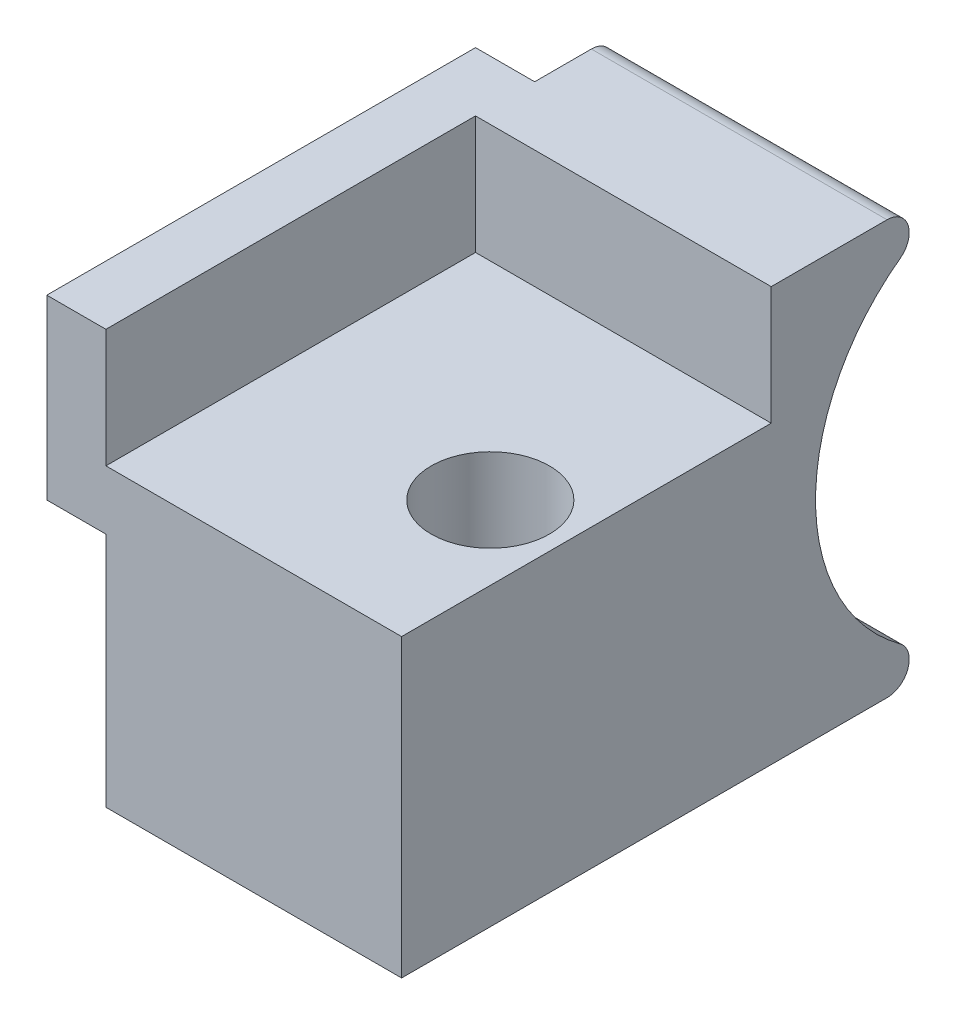
ISO-10303-21;
HEADER;
FILE_DESCRIPTION(('STEP AP214'),'2;1');
FILE_NAME('part.step','',(''),(''),'','','');
FILE_SCHEMA(('AUTOMOTIVE_DESIGN { 1 0 10303 214 1 1 1 1 }'));
ENDSEC;
DATA;
#1=APPLICATION_CONTEXT('core data for automotive mechanical design processes');
#2=APPLICATION_PROTOCOL_DEFINITION('international standard','automotive_design',2000,#1);
#3=PRODUCT_CONTEXT('',#1,'mechanical');
#4=PRODUCT('Part','Part','',(#3));
#5=PRODUCT_RELATED_PRODUCT_CATEGORY('part','',(#4));
#6=PRODUCT_DEFINITION_FORMATION('','',#4);
#7=PRODUCT_DEFINITION_CONTEXT('part definition',#1,'design');
#8=PRODUCT_DEFINITION('design','',#6,#7);
#9=PRODUCT_DEFINITION_SHAPE('','',#8);
#10=(LENGTH_UNIT() NAMED_UNIT(*) SI_UNIT(.MILLI.,.METRE.));
#11=(NAMED_UNIT(*) PLANE_ANGLE_UNIT() SI_UNIT($,.RADIAN.));
#12=(NAMED_UNIT(*) SI_UNIT($,.STERADIAN.) SOLID_ANGLE_UNIT());
#13=UNCERTAINTY_MEASURE_WITH_UNIT(LENGTH_MEASURE(1.E-05),#10,'distance_accuracy_value','');
#14=(GEOMETRIC_REPRESENTATION_CONTEXT(3) GLOBAL_UNCERTAINTY_ASSIGNED_CONTEXT((#13)) GLOBAL_UNIT_ASSIGNED_CONTEXT((#10,
#11,#12)) REPRESENTATION_CONTEXT('',''));
#15=CARTESIAN_POINT('',(0.,0.,0.));
#16=DIRECTION('',(0.,0.,1.));
#17=DIRECTION('',(1.,0.,0.));
#18=AXIS2_PLACEMENT_3D('',#15,#16,#17);
#19=CARTESIAN_POINT('',(0.5,-1.4,0.916515138991168));
#20=DIRECTION('',(-1.,0.,0.));
#21=DIRECTION('',(0.,0.,1.));
#22=AXIS2_PLACEMENT_3D('',#19,#20,#21);
#23=PLANE('',#22);
#24=CARTESIAN_POINT('',(0.5,1.25,0.916515138991168));
#25=DIRECTION('',(1.,0.,0.));
#26=DIRECTION('',(0.,0.,-1.));
#27=AXIS2_PLACEMENT_3D('',#24,#25,#26);
#28=CIRCLE('',#27,0.15);
#29=CARTESIAN_POINT('',(0.5,1.12903225806452,0.82782012554041));
#30=VERTEX_POINT('',#29);
#31=CARTESIAN_POINT('',(0.5,1.4,0.916515138991168));
#32=VERTEX_POINT('',#31);
#33=EDGE_CURVE('E49',#30,#32,#28,.T.);
#34=ORIENTED_EDGE('',*,*,#33,.T.);
#35=DIRECTION('',(0.,0.,-1.));
#36=VECTOR('',#35,1.);
#37=CARTESIAN_POINT('',(0.5,1.4,0.));
#38=LINE('',#37,#36);
#39=CARTESIAN_POINT('',(0.5,1.4,1.7));
#40=VERTEX_POINT('',#39);
#41=EDGE_CURVE('E57',#40,#32,#38,.T.);
#42=ORIENTED_EDGE('',*,*,#41,.F.);
#43=DIRECTION('',(0.,-1.,0.));
#44=VECTOR('',#43,1.);
#45=CARTESIAN_POINT('',(0.5,0.,1.7));
#46=LINE('',#45,#44);
#47=CARTESIAN_POINT('',(0.5,0.6,1.7));
#48=VERTEX_POINT('',#47);
#49=EDGE_CURVE('E232',#40,#48,#46,.T.);
#50=ORIENTED_EDGE('',*,*,#49,.T.);
#51=DIRECTION('',(0.,0.,1.));
#52=VECTOR('',#51,1.);
#53=CARTESIAN_POINT('',(0.5,0.6,0.));
#54=LINE('',#53,#52);
#55=CARTESIAN_POINT('',(0.5,0.6,4.2));
#56=VERTEX_POINT('',#55);
#57=EDGE_CURVE('E231',#48,#56,#54,.T.);
#58=ORIENTED_EDGE('',*,*,#57,.T.);
#59=DIRECTION('',(0.,-1.,0.));
#60=VECTOR('',#59,1.);
#61=CARTESIAN_POINT('',(0.5,0.,4.2));
#62=LINE('',#61,#60);
#63=CARTESIAN_POINT('',(0.5,-1.4,4.2));
#64=VERTEX_POINT('',#63);
#65=EDGE_CURVE('E44',#56,#64,#62,.T.);
#66=ORIENTED_EDGE('',*,*,#65,.T.);
#67=DIRECTION('',(0.,0.,1.));
#68=VECTOR('',#67,1.);
#69=CARTESIAN_POINT('',(0.5,-1.4,0.));
#70=LINE('',#69,#68);
#71=CARTESIAN_POINT('',(0.5,-1.4,0.916515138991168));
#72=VERTEX_POINT('',#71);
#73=EDGE_CURVE('E65',#72,#64,#70,.T.);
#74=ORIENTED_EDGE('',*,*,#73,.F.);
#75=CARTESIAN_POINT('',(0.5,-1.25,0.916515138991168));
#76=DIRECTION('',(1.,0.,0.));
#77=DIRECTION('',(0.,0.,-1.));
#78=AXIS2_PLACEMENT_3D('',#75,#76,#77);
#79=CIRCLE('',#78,0.15);
#80=CARTESIAN_POINT('',(0.5,-1.12903225806452,0.82782012554041));
#81=VERTEX_POINT('',#80);
#82=EDGE_CURVE('E12',#72,#81,#79,.T.);
#83=ORIENTED_EDGE('',*,*,#82,.T.);
#84=CARTESIAN_POINT('',(0.5,0.,0.));
#85=DIRECTION('',(1.,0.,0.));
#86=DIRECTION('',(0.,0.,-1.));
#87=AXIS2_PLACEMENT_3D('',#84,#85,#86);
#88=CIRCLE('',#87,1.4);
#89=EDGE_CURVE('E257',#30,#81,#88,.T.);
#90=ORIENTED_EDGE('',*,*,#89,.F.);
#91=EDGE_LOOP('',(#34,#42,#50,#58,#66,#74,#83,#90));
#92=FACE_BOUND('',#91,.T.);
#93=ADVANCED_FACE('F41',(#92),#23,.F.);
#94=CARTESIAN_POINT('',(5.43847096529504,0.6,0.));
#95=DIRECTION('',(0.,1.,0.));
#96=DIRECTION('',(0.,0.,1.));
#97=AXIS2_PLACEMENT_3D('',#94,#95,#96);
#98=PLANE('',#97);
#99=ORIENTED_EDGE('',*,*,#57,.F.);
#100=DIRECTION('',(-1.,0.,0.));
#101=VECTOR('',#100,1.);
#102=CARTESIAN_POINT('',(5.43847096529504,0.6,1.7));
#103=LINE('',#102,#101);
#104=CARTESIAN_POINT('',(-1.5,0.6,1.7));
#105=VERTEX_POINT('',#104);
#106=EDGE_CURVE('E196',#48,#105,#103,.T.);
#107=ORIENTED_EDGE('',*,*,#106,.T.);
#108=DIRECTION('',(0.,0.,-1.));
#109=VECTOR('',#108,1.);
#110=CARTESIAN_POINT('',(-1.5,0.6,0.));
#111=LINE('',#110,#109);
#112=CARTESIAN_POINT('',(-1.5,0.6,4.2));
#113=VERTEX_POINT('',#112);
#114=EDGE_CURVE('E170',#113,#105,#111,.T.);
#115=ORIENTED_EDGE('',*,*,#114,.F.);
#116=DIRECTION('',(-1.,0.,0.));
#117=VECTOR('',#116,1.);
#118=CARTESIAN_POINT('',(5.43847096529504,0.6,4.2));
#119=LINE('',#118,#117);
#120=EDGE_CURVE('E198',#56,#113,#119,.T.);
#121=ORIENTED_EDGE('',*,*,#120,.F.);
#122=EDGE_LOOP('',(#99,#107,#115,#121));
#123=FACE_BOUND('',#122,.T.);
#124=CARTESIAN_POINT('',(0.,0.6,3.1));
#125=DIRECTION('',(0.,1.,0.));
#126=DIRECTION('',(0.,0.,1.));
#127=AXIS2_PLACEMENT_3D('',#124,#125,#126);
#128=CIRCLE('',#127,0.4);
#129=CARTESIAN_POINT('',(0.,0.599999999999999,3.5));
#130=VERTEX_POINT('',#129);
#131=EDGE_CURVE('E263',#130,#130,#128,.T.);
#132=ORIENTED_EDGE('',*,*,#131,.F.);
#133=EDGE_LOOP('',(#132));
#134=FACE_BOUND('',#133,.T.);
#135=ADVANCED_FACE('F241',(#123,#134),#98,.T.);
#136=CARTESIAN_POINT('',(0.,-1.4,3.1));
#137=DIRECTION('',(0.,1.,0.));
#138=DIRECTION('',(0.,0.,1.));
#139=AXIS2_PLACEMENT_3D('',#136,#137,#138);
#140=CYLINDRICAL_SURFACE('',#139,0.4);
#141=CARTESIAN_POINT('',(0.,-1.4,3.1));
#142=DIRECTION('',(0.,1.,0.));
#143=DIRECTION('',(0.,0.,1.));
#144=AXIS2_PLACEMENT_3D('',#141,#142,#143);
#145=CIRCLE('',#144,0.4);
#146=CARTESIAN_POINT('',(0.,-1.4,3.5));
#147=VERTEX_POINT('',#146);
#148=EDGE_CURVE('E261',#147,#147,#145,.T.);
#149=ORIENTED_EDGE('',*,*,#148,.F.);
#150=EDGE_LOOP('',(#149));
#151=FACE_BOUND('',#150,.T.);
#152=ORIENTED_EDGE('',*,*,#131,.T.);
#153=EDGE_LOOP('',(#152));
#154=FACE_BOUND('',#153,.T.);
#155=ADVANCED_FACE('F271',(#151,#154),#140,.F.);
#156=CARTESIAN_POINT('',(5.43847096529504,0.200000000000001,0.));
#157=DIRECTION('',(0.,-1.,0.));
#158=DIRECTION('',(0.,0.,-1.));
#159=AXIS2_PLACEMENT_3D('',#156,#157,#158);
#160=PLANE('',#159);
#161=DIRECTION('',(-1.,0.,0.));
#162=VECTOR('',#161,1.);
#163=CARTESIAN_POINT('',(5.43847096529504,0.2,1.3856406460551));
#164=LINE('',#163,#162);
#165=CARTESIAN_POINT('',(-1.5,0.2,1.3856406460551));
#166=VERTEX_POINT('',#165);
#167=CARTESIAN_POINT('',(-1.9,0.2,1.3856406460551));
#168=VERTEX_POINT('',#167);
#169=EDGE_CURVE('E192',#166,#168,#164,.T.);
#170=ORIENTED_EDGE('',*,*,#169,.F.);
#171=DIRECTION('',(0.,0.,1.));
#172=VECTOR('',#171,1.);
#173=CARTESIAN_POINT('',(-1.5,0.200000000000001,0.));
#174=LINE('',#173,#172);
#175=CARTESIAN_POINT('',(-1.5,0.2,4.2));
#176=VERTEX_POINT('',#175);
#177=EDGE_CURVE('E205',#166,#176,#174,.T.);
#178=ORIENTED_EDGE('',*,*,#177,.T.);
#179=DIRECTION('',(-1.,0.,0.));
#180=VECTOR('',#179,1.);
#181=CARTESIAN_POINT('',(5.43847096529504,0.2,4.2));
#182=LINE('',#181,#180);
#183=CARTESIAN_POINT('',(-1.9,0.2,4.2));
#184=VERTEX_POINT('',#183);
#185=EDGE_CURVE('E188',#176,#184,#182,.T.);
#186=ORIENTED_EDGE('',*,*,#185,.T.);
#187=DIRECTION('',(0.,0.,-1.));
#188=VECTOR('',#187,1.);
#189=CARTESIAN_POINT('',(-1.9,0.200000000000001,0.));
#190=LINE('',#189,#188);
#191=EDGE_CURVE('E149',#184,#168,#190,.T.);
#192=ORIENTED_EDGE('',*,*,#191,.T.);
#193=EDGE_LOOP('',(#170,#178,#186,#192));
#194=FACE_BOUND('',#193,.T.);
#195=ADVANCED_FACE('F274',(#194),#160,.T.);
#196=CARTESIAN_POINT('',(-1.5,0.,0.));
#197=DIRECTION('',(1.,0.,0.));
#198=DIRECTION('',(0.,0.,-1.));
#199=AXIS2_PLACEMENT_3D('',#196,#197,#198);
#200=PLANE('',#199);
#201=DIRECTION('',(0.,1.,0.));
#202=VECTOR('',#201,1.);
#203=CARTESIAN_POINT('',(-1.5,0.,4.2));
#204=LINE('',#203,#202);
#205=CARTESIAN_POINT('',(-1.5,1.4,4.2));
#206=VERTEX_POINT('',#205);
#207=EDGE_CURVE('E164',#113,#206,#204,.T.);
#208=ORIENTED_EDGE('',*,*,#207,.F.);
#209=ORIENTED_EDGE('',*,*,#114,.T.);
#210=DIRECTION('',(0.,1.,0.));
#211=VECTOR('',#210,1.);
#212=CARTESIAN_POINT('',(-1.5,0.,1.7));
#213=LINE('',#212,#211);
#214=CARTESIAN_POINT('',(-1.5,1.4,1.7));
#215=VERTEX_POINT('',#214);
#216=EDGE_CURVE('E166',#105,#215,#213,.T.);
#217=ORIENTED_EDGE('',*,*,#216,.T.);
#218=DIRECTION('',(0.,0.,1.));
#219=VECTOR('',#218,1.);
#220=CARTESIAN_POINT('',(-1.5,1.4,0.));
#221=LINE('',#220,#219);
#222=EDGE_CURVE('E167',#215,#206,#221,.T.);
#223=ORIENTED_EDGE('',*,*,#222,.T.);
#224=EDGE_LOOP('',(#208,#209,#217,#223));
#225=FACE_BOUND('',#224,.T.);
#226=ADVANCED_FACE('F288',(#225),#200,.T.);
#227=CARTESIAN_POINT('',(1.5,0.,4.2));
#228=DIRECTION('',(0.,0.,1.));
#229=DIRECTION('',(1.,0.,0.));
#230=AXIS2_PLACEMENT_3D('',#227,#228,#229);
#231=PLANE('',#230);
#232=ORIENTED_EDGE('',*,*,#65,.F.);
#233=ORIENTED_EDGE('',*,*,#120,.T.);
#234=ORIENTED_EDGE('',*,*,#207,.T.);
#235=DIRECTION('',(1.,0.,0.));
#236=VECTOR('',#235,1.);
#237=CARTESIAN_POINT('',(-1.9,1.4,4.2));
#238=LINE('',#237,#236);
#239=CARTESIAN_POINT('',(-1.9,1.4,4.2));
#240=VERTEX_POINT('',#239);
#241=EDGE_CURVE('E157',#240,#206,#238,.T.);
#242=ORIENTED_EDGE('',*,*,#241,.F.);
#243=DIRECTION('',(0.,-1.,0.));
#244=VECTOR('',#243,1.);
#245=CARTESIAN_POINT('',(-1.9,0.,4.2));
#246=LINE('',#245,#244);
#247=EDGE_CURVE('E141',#240,#184,#246,.T.);
#248=ORIENTED_EDGE('',*,*,#247,.T.);
#249=ORIENTED_EDGE('',*,*,#185,.F.);
#250=DIRECTION('',(0.,1.,0.));
#251=VECTOR('',#250,1.);
#252=CARTESIAN_POINT('',(-1.5,0.,4.2));
#253=LINE('',#252,#251);
#254=CARTESIAN_POINT('',(-1.5,-1.4,4.2));
#255=VERTEX_POINT('',#254);
#256=EDGE_CURVE('E207',#255,#176,#253,.T.);
#257=ORIENTED_EDGE('',*,*,#256,.F.);
#258=DIRECTION('',(-1.,0.,0.));
#259=VECTOR('',#258,1.);
#260=CARTESIAN_POINT('',(1.5,-1.4,4.2));
#261=LINE('',#260,#259);
#262=EDGE_CURVE('E213',#64,#255,#261,.T.);
#263=ORIENTED_EDGE('',*,*,#262,.F.);
#264=EDGE_LOOP('',(#232,#233,#234,#242,#248,#249,#257,#263));
#265=FACE_BOUND('',#264,.T.);
#266=ADVANCED_FACE('F162',(#265),#231,.T.);
#267=CARTESIAN_POINT('',(-1.9,0.,0.));
#268=DIRECTION('',(1.,0.,0.));
#269=DIRECTION('',(0.,0.,-1.));
#270=AXIS2_PLACEMENT_3D('',#267,#268,#269);
#271=PLANE('',#270);
#272=ORIENTED_EDGE('',*,*,#247,.F.);
#273=DIRECTION('',(0.,0.,-1.));
#274=VECTOR('',#273,1.);
#275=CARTESIAN_POINT('',(-1.9,1.4,0.));
#276=LINE('',#275,#274);
#277=CARTESIAN_POINT('',(-1.9,1.4,1.3));
#278=VERTEX_POINT('',#277);
#279=EDGE_CURVE('E145',#240,#278,#276,.T.);
#280=ORIENTED_EDGE('',*,*,#279,.T.);
#281=DIRECTION('',(0.,1.,0.));
#282=VECTOR('',#281,1.);
#283=CARTESIAN_POINT('',(-1.9,0.,1.3));
#284=LINE('',#283,#282);
#285=CARTESIAN_POINT('',(-1.9,0.519615242270661,1.3));
#286=VERTEX_POINT('',#285);
#287=EDGE_CURVE('E160',#286,#278,#284,.T.);
#288=ORIENTED_EDGE('',*,*,#287,.F.);
#289=CARTESIAN_POINT('',(-1.9,0.,0.));
#290=DIRECTION('',(1.,0.,0.));
#291=DIRECTION('',(0.,0.,-1.));
#292=AXIS2_PLACEMENT_3D('',#289,#290,#291);
#293=CIRCLE('',#292,1.4);
#294=EDGE_CURVE('E185',#168,#286,#293,.F.);
#295=ORIENTED_EDGE('',*,*,#294,.F.);
#296=ORIENTED_EDGE('',*,*,#191,.F.);
#297=EDGE_LOOP('',(#272,#280,#288,#295,#296));
#298=FACE_BOUND('',#297,.T.);
#299=ADVANCED_FACE('F143',(#298),#271,.F.);
#300=CARTESIAN_POINT('',(5.43847096529504,0.,1.3));
#301=DIRECTION('',(0.,0.,-1.));
#302=DIRECTION('',(-1.,0.,0.));
#303=AXIS2_PLACEMENT_3D('',#300,#301,#302);
#304=PLANE('',#303);
#305=DIRECTION('',(-1.,0.,0.));
#306=VECTOR('',#305,1.);
#307=CARTESIAN_POINT('',(5.43847096529504,1.4,1.3));
#308=LINE('',#307,#306);
#309=CARTESIAN_POINT('',(-1.5,1.4,1.3));
#310=VERTEX_POINT('',#309);
#311=EDGE_CURVE('E159',#310,#278,#308,.T.);
#312=ORIENTED_EDGE('',*,*,#311,.F.);
#313=DIRECTION('',(0.,1.,0.));
#314=VECTOR('',#313,1.);
#315=CARTESIAN_POINT('',(-1.5,0.,1.3));
#316=LINE('',#315,#314);
#317=CARTESIAN_POINT('',(-1.5,0.519615242270661,1.3));
#318=VERTEX_POINT('',#317);
#319=EDGE_CURVE('E181',#318,#310,#316,.T.);
#320=ORIENTED_EDGE('',*,*,#319,.F.);
#321=DIRECTION('',(-1.,0.,0.));
#322=VECTOR('',#321,1.);
#323=CARTESIAN_POINT('',(5.43847096529504,0.519615242270661,1.3));
#324=LINE('',#323,#322);
#325=EDGE_CURVE('E190',#318,#286,#324,.T.);
#326=ORIENTED_EDGE('',*,*,#325,.T.);
#327=ORIENTED_EDGE('',*,*,#287,.T.);
#328=EDGE_LOOP('',(#312,#320,#326,#327));
#329=FACE_BOUND('',#328,.T.);
#330=ADVANCED_FACE('F319',(#329),#304,.T.);
#331=CARTESIAN_POINT('',(5.43847096529504,0.,1.7));
#332=DIRECTION('',(0.,0.,1.));
#333=DIRECTION('',(1.,0.,0.));
#334=AXIS2_PLACEMENT_3D('',#331,#332,#333);
#335=PLANE('',#334);
#336=ORIENTED_EDGE('',*,*,#49,.F.);
#337=DIRECTION('',(-1.,0.,0.));
#338=VECTOR('',#337,1.);
#339=CARTESIAN_POINT('',(5.43847096529504,1.4,1.7));
#340=LINE('',#339,#338);
#341=EDGE_CURVE('E194',#40,#215,#340,.T.);
#342=ORIENTED_EDGE('',*,*,#341,.T.);
#343=ORIENTED_EDGE('',*,*,#216,.F.);
#344=ORIENTED_EDGE('',*,*,#106,.F.);
#345=EDGE_LOOP('',(#336,#342,#343,#344));
#346=FACE_BOUND('',#345,.T.);
#347=ADVANCED_FACE('F284',(#346),#335,.T.);
#348=CARTESIAN_POINT('',(5.43847096529504,1.4,0.));
#349=DIRECTION('',(0.,-1.,0.));
#350=DIRECTION('',(0.,0.,-1.));
#351=AXIS2_PLACEMENT_3D('',#348,#349,#350);
#352=PLANE('',#351);
#353=ORIENTED_EDGE('',*,*,#341,.F.);
#354=ORIENTED_EDGE('',*,*,#41,.T.);
#355=DIRECTION('',(1.,0.,0.));
#356=VECTOR('',#355,1.);
#357=CARTESIAN_POINT('',(-1.5,1.4,0.916515138991168));
#358=LINE('',#357,#356);
#359=CARTESIAN_POINT('',(-1.5,1.4,0.916515138991168));
#360=VERTEX_POINT('',#359);
#361=EDGE_CURVE('E225',#32,#360,#358,.F.);
#362=ORIENTED_EDGE('',*,*,#361,.T.);
#363=DIRECTION('',(0.,0.,1.));
#364=VECTOR('',#363,1.);
#365=CARTESIAN_POINT('',(-1.5,1.4,0.));
#366=LINE('',#365,#364);
#367=EDGE_CURVE('E179',#360,#310,#366,.T.);
#368=ORIENTED_EDGE('',*,*,#367,.T.);
#369=ORIENTED_EDGE('',*,*,#311,.T.);
#370=ORIENTED_EDGE('',*,*,#279,.F.);
#371=ORIENTED_EDGE('',*,*,#241,.T.);
#372=ORIENTED_EDGE('',*,*,#222,.F.);
#373=EDGE_LOOP('',(#353,#354,#362,#368,#369,#370,#371,#372));
#374=FACE_BOUND('',#373,.T.);
#375=ADVANCED_FACE('F155',(#374),#352,.F.);
#376=CARTESIAN_POINT('',(-1.5,0.,0.));
#377=DIRECTION('',(1.,0.,0.));
#378=DIRECTION('',(0.,0.,-1.));
#379=AXIS2_PLACEMENT_3D('',#376,#377,#378);
#380=PLANE('',#379);
#381=ORIENTED_EDGE('',*,*,#367,.F.);
#382=CARTESIAN_POINT('',(-1.5,1.25,0.916515138991168));
#383=DIRECTION('',(1.,0.,0.));
#384=DIRECTION('',(0.,0.,-1.));
#385=AXIS2_PLACEMENT_3D('',#382,#383,#384);
#386=CIRCLE('',#385,0.15);
#387=CARTESIAN_POINT('',(-1.5,1.12903225806452,0.82782012554041));
#388=VERTEX_POINT('',#387);
#389=EDGE_CURVE('E227',#360,#388,#386,.F.);
#390=ORIENTED_EDGE('',*,*,#389,.T.);
#391=CARTESIAN_POINT('',(-1.5,0.,0.));
#392=DIRECTION('',(1.,0.,0.));
#393=DIRECTION('',(0.,0.,-1.));
#394=AXIS2_PLACEMENT_3D('',#391,#392,#393);
#395=CIRCLE('',#394,1.4);
#396=EDGE_CURVE('E177',#388,#318,#395,.T.);
#397=ORIENTED_EDGE('',*,*,#396,.T.);
#398=ORIENTED_EDGE('',*,*,#319,.T.);
#399=EDGE_LOOP('',(#381,#390,#397,#398));
#400=FACE_BOUND('',#399,.T.);
#401=ADVANCED_FACE('F299',(#400),#380,.F.);
#402=CARTESIAN_POINT('',(1.5,0.,0.));
#403=DIRECTION('',(-1.,0.,0.));
#404=DIRECTION('',(0.,0.,1.));
#405=AXIS2_PLACEMENT_3D('',#402,#403,#404);
#406=CYLINDRICAL_SURFACE('',#405,1.4);
#407=ORIENTED_EDGE('',*,*,#89,.T.);
#408=DIRECTION('',(-1.,0.,0.));
#409=VECTOR('',#408,1.);
#410=CARTESIAN_POINT('',(1.5,-1.12903225806452,0.82782012554041));
#411=LINE('',#410,#409);
#412=CARTESIAN_POINT('',(-1.5,-1.12903225806452,0.82782012554041));
#413=VERTEX_POINT('',#412);
#414=EDGE_CURVE('E218',#81,#413,#411,.T.);
#415=ORIENTED_EDGE('',*,*,#414,.T.);
#416=CARTESIAN_POINT('',(-1.5,0.,0.));
#417=DIRECTION('',(1.,0.,0.));
#418=DIRECTION('',(0.,0.,-1.));
#419=AXIS2_PLACEMENT_3D('',#416,#417,#418);
#420=CIRCLE('',#419,1.4);
#421=EDGE_CURVE('E202',#166,#413,#420,.T.);
#422=ORIENTED_EDGE('',*,*,#421,.F.);
#423=ORIENTED_EDGE('',*,*,#169,.T.);
#424=ORIENTED_EDGE('',*,*,#294,.T.);
#425=ORIENTED_EDGE('',*,*,#325,.F.);
#426=ORIENTED_EDGE('',*,*,#396,.F.);
#427=DIRECTION('',(-1.,0.,0.));
#428=VECTOR('',#427,1.);
#429=CARTESIAN_POINT('',(1.5,1.12903225806452,0.82782012554041));
#430=LINE('',#429,#428);
#431=EDGE_CURVE('E215',#388,#30,#430,.F.);
#432=ORIENTED_EDGE('',*,*,#431,.T.);
#433=EDGE_LOOP('',(#407,#415,#422,#423,#424,#425,#426,#432));
#434=FACE_BOUND('',#433,.T.);
#435=ADVANCED_FACE('F256',(#434),#406,.F.);
#436=CARTESIAN_POINT('',(1.5,1.25,0.916515138991168));
#437=DIRECTION('',(-1.,0.,0.));
#438=DIRECTION('',(0.,0.,1.));
#439=AXIS2_PLACEMENT_3D('',#436,#437,#438);
#440=CYLINDRICAL_SURFACE('',#439,0.15);
#441=ORIENTED_EDGE('',*,*,#33,.F.);
#442=ORIENTED_EDGE('',*,*,#431,.F.);
#443=ORIENTED_EDGE('',*,*,#389,.F.);
#444=ORIENTED_EDGE('',*,*,#361,.F.);
#445=EDGE_LOOP('',(#441,#442,#443,#444));
#446=FACE_BOUND('',#445,.T.);
#447=ADVANCED_FACE('F292',(#446),#440,.T.);
#448=CARTESIAN_POINT('',(-1.5,0.,0.));
#449=DIRECTION('',(1.,0.,0.));
#450=DIRECTION('',(0.,0.,-1.));
#451=AXIS2_PLACEMENT_3D('',#448,#449,#450);
#452=PLANE('',#451);
#453=ORIENTED_EDGE('',*,*,#421,.T.);
#454=CARTESIAN_POINT('',(-1.5,-1.25,0.916515138991168));
#455=DIRECTION('',(1.,0.,0.));
#456=DIRECTION('',(0.,0.,-1.));
#457=AXIS2_PLACEMENT_3D('',#454,#455,#456);
#458=CIRCLE('',#457,0.15);
#459=CARTESIAN_POINT('',(-1.5,-1.4,0.916515138991168));
#460=VERTEX_POINT('',#459);
#461=EDGE_CURVE('E221',#413,#460,#458,.F.);
#462=ORIENTED_EDGE('',*,*,#461,.T.);
#463=DIRECTION('',(0.,0.,1.));
#464=VECTOR('',#463,1.);
#465=CARTESIAN_POINT('',(-1.5,-1.4,0.));
#466=LINE('',#465,#464);
#467=EDGE_CURVE('E210',#460,#255,#466,.T.);
#468=ORIENTED_EDGE('',*,*,#467,.T.);
#469=ORIENTED_EDGE('',*,*,#256,.T.);
#470=ORIENTED_EDGE('',*,*,#177,.F.);
#471=EDGE_LOOP('',(#453,#462,#468,#469,#470));
#472=FACE_BOUND('',#471,.T.);
#473=ADVANCED_FACE('F249',(#472),#452,.F.);
#474=CARTESIAN_POINT('',(1.5,-1.4,0.));
#475=DIRECTION('',(0.,-1.,0.));
#476=DIRECTION('',(0.,0.,-1.));
#477=AXIS2_PLACEMENT_3D('',#474,#475,#476);
#478=PLANE('',#477);
#479=ORIENTED_EDGE('',*,*,#73,.T.);
#480=ORIENTED_EDGE('',*,*,#262,.T.);
#481=ORIENTED_EDGE('',*,*,#467,.F.);
#482=DIRECTION('',(-1.,0.,0.));
#483=VECTOR('',#482,1.);
#484=CARTESIAN_POINT('',(1.5,-1.4,0.916515138991168));
#485=LINE('',#484,#483);
#486=EDGE_CURVE('E223',#460,#72,#485,.F.);
#487=ORIENTED_EDGE('',*,*,#486,.T.);
#488=EDGE_LOOP('',(#479,#480,#481,#487));
#489=FACE_BOUND('',#488,.T.);
#490=ORIENTED_EDGE('',*,*,#148,.T.);
#491=EDGE_LOOP('',(#490));
#492=FACE_BOUND('',#491,.T.);
#493=ADVANCED_FACE('F245',(#489,#492),#478,.T.);
#494=CARTESIAN_POINT('',(1.5,-1.25,0.916515138991168));
#495=DIRECTION('',(-1.,0.,0.));
#496=DIRECTION('',(0.,0.,1.));
#497=AXIS2_PLACEMENT_3D('',#494,#495,#496);
#498=CYLINDRICAL_SURFACE('',#497,0.15);
#499=ORIENTED_EDGE('',*,*,#82,.F.);
#500=ORIENTED_EDGE('',*,*,#486,.F.);
#501=ORIENTED_EDGE('',*,*,#461,.F.);
#502=ORIENTED_EDGE('',*,*,#414,.F.);
#503=EDGE_LOOP('',(#499,#500,#501,#502));
#504=FACE_BOUND('',#503,.T.);
#505=ADVANCED_FACE('F254',(#504),#498,.T.);
#506=CLOSED_SHELL('',(#93,#135,#155,#195,#226,#266,#299,#330,#347,#375,#401,#435,#447,#473,#493,#505));
#507=MANIFOLD_SOLID_BREP('B2',#506);
#508=ADVANCED_BREP_SHAPE_REPRESENTATION('',(#18,#507),#14);
#509=SHAPE_DEFINITION_REPRESENTATION(#9,#508);
ENDSEC;
END-ISO-10303-21;
